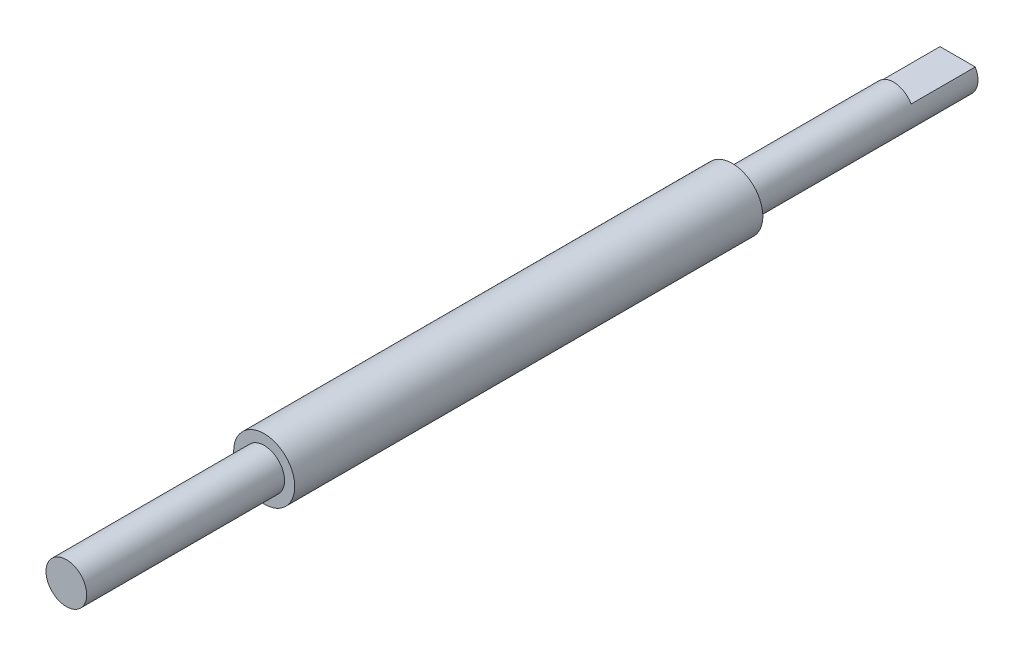
ISO-10303-21;
HEADER;
FILE_DESCRIPTION(('STEP AP214'),'2;1');
FILE_NAME('part.step','',(''),(''),'','','');
FILE_SCHEMA(('AUTOMOTIVE_DESIGN { 1 0 10303 214 1 1 1 1 }'));
ENDSEC;
DATA;
#1=APPLICATION_CONTEXT('core data for automotive mechanical design processes');
#2=APPLICATION_PROTOCOL_DEFINITION('international standard','automotive_design',2000,#1);
#3=PRODUCT_CONTEXT('',#1,'mechanical');
#4=PRODUCT('Part','Part','',(#3));
#5=PRODUCT_RELATED_PRODUCT_CATEGORY('part','',(#4));
#6=PRODUCT_DEFINITION_FORMATION('','',#4);
#7=PRODUCT_DEFINITION_CONTEXT('part definition',#1,'design');
#8=PRODUCT_DEFINITION('design','',#6,#7);
#9=PRODUCT_DEFINITION_SHAPE('','',#8);
#10=(LENGTH_UNIT() NAMED_UNIT(*) SI_UNIT(.MILLI.,.METRE.));
#11=(NAMED_UNIT(*) PLANE_ANGLE_UNIT() SI_UNIT($,.RADIAN.));
#12=(NAMED_UNIT(*) SI_UNIT($,.STERADIAN.) SOLID_ANGLE_UNIT());
#13=UNCERTAINTY_MEASURE_WITH_UNIT(LENGTH_MEASURE(1.E-05),#10,'distance_accuracy_value','');
#14=(GEOMETRIC_REPRESENTATION_CONTEXT(3) GLOBAL_UNCERTAINTY_ASSIGNED_CONTEXT((#13)) GLOBAL_UNIT_ASSIGNED_CONTEXT((#10,
#11,#12)) REPRESENTATION_CONTEXT('',''));
#15=CARTESIAN_POINT('',(0.,0.,0.));
#16=DIRECTION('',(0.,0.,1.));
#17=DIRECTION('',(1.,0.,0.));
#18=AXIS2_PLACEMENT_3D('',#15,#16,#17);
#19=CARTESIAN_POINT('',(0.,0.,0.));
#20=DIRECTION('',(0.,0.,1.));
#21=DIRECTION('',(1.,0.,0.));
#22=AXIS2_PLACEMENT_3D('',#19,#20,#21);
#23=PLANE('',#22);
#24=DIRECTION('',(1.,0.,0.));
#25=VECTOR('',#24,1.);
#26=CARTESIAN_POINT('',(-5.49926131403118,3.175,0.));
#27=LINE('',#26,#25);
#28=CARTESIAN_POINT('',(-5.49926131403118,3.175,0.));
#29=VERTEX_POINT('',#28);
#30=CARTESIAN_POINT('',(5.49926131403118,3.175,0.));
#31=VERTEX_POINT('',#30);
#32=EDGE_CURVE('E67',#29,#31,#27,.T.);
#33=ORIENTED_EDGE('',*,*,#32,.T.);
#34=CARTESIAN_POINT('',(0.,0.,0.));
#35=DIRECTION('',(0.,0.,1.));
#36=DIRECTION('',(1.,0.,0.));
#37=AXIS2_PLACEMENT_3D('',#34,#35,#36);
#38=CIRCLE('',#37,6.35);
#39=EDGE_CURVE('E79',#29,#31,#38,.T.);
#40=ORIENTED_EDGE('',*,*,#39,.F.);
#41=EDGE_LOOP('',(#33,#40));
#42=FACE_BOUND('',#41,.T.);
#43=ADVANCED_FACE('F41',(#42),#23,.F.);
#44=CARTESIAN_POINT('',(0.,0.,278.));
#45=DIRECTION('',(0.,0.,-1.));
#46=DIRECTION('',(-1.,0.,0.));
#47=AXIS2_PLACEMENT_3D('',#44,#45,#46);
#48=CYLINDRICAL_SURFACE('',#47,6.35);
#49=CARTESIAN_POINT('',(0.,0.,70.2975));
#50=DIRECTION('',(0.,0.,-1.));
#51=DIRECTION('',(-1.,0.,0.));
#52=AXIS2_PLACEMENT_3D('',#49,#50,#51);
#53=CIRCLE('',#52,6.35);
#54=CARTESIAN_POINT('',(-6.35,0.,70.2975));
#55=VERTEX_POINT('',#54);
#56=EDGE_CURVE('E84',#55,#55,#53,.T.);
#57=ORIENTED_EDGE('',*,*,#56,.T.);
#58=EDGE_LOOP('',(#57));
#59=FACE_BOUND('',#58,.T.);
#60=DIRECTION('',(0.,0.,-1.));
#61=VECTOR('',#60,1.);
#62=CARTESIAN_POINT('',(5.49926131403118,3.175,20.));
#63=LINE('',#62,#61);
#64=CARTESIAN_POINT('',(5.49926131403118,3.175,20.));
#65=VERTEX_POINT('',#64);
#66=EDGE_CURVE('E70',#65,#31,#63,.T.);
#67=ORIENTED_EDGE('',*,*,#66,.F.);
#68=CARTESIAN_POINT('',(0.,0.,20.));
#69=DIRECTION('',(0.,0.,1.));
#70=DIRECTION('',(1.,0.,0.));
#71=AXIS2_PLACEMENT_3D('',#68,#69,#70);
#72=CIRCLE('',#71,6.35);
#73=CARTESIAN_POINT('',(-5.49926131403118,3.175,20.));
#74=VERTEX_POINT('',#73);
#75=EDGE_CURVE('E75',#65,#74,#72,.T.);
#76=ORIENTED_EDGE('',*,*,#75,.T.);
#77=DIRECTION('',(0.,0.,-1.));
#78=VECTOR('',#77,1.);
#79=CARTESIAN_POINT('',(-5.49926131403118,3.175,20.));
#80=LINE('',#79,#78);
#81=EDGE_CURVE('E57',#74,#29,#80,.T.);
#82=ORIENTED_EDGE('',*,*,#81,.T.);
#83=ORIENTED_EDGE('',*,*,#39,.T.);
#84=EDGE_LOOP('',(#67,#76,#82,#83));
#85=FACE_BOUND('',#84,.T.);
#86=ADVANCED_FACE('F43',(#59,#85),#48,.T.);
#87=CARTESIAN_POINT('',(0.,0.,278.));
#88=DIRECTION('',(0.,0.,1.));
#89=DIRECTION('',(1.,0.,0.));
#90=AXIS2_PLACEMENT_3D('',#87,#88,#89);
#91=CIRCLE('',#90,6.35);
#92=CARTESIAN_POINT('',(6.35,0.,278.));
#93=VERTEX_POINT('',#92);
#94=EDGE_CURVE('E50',#93,#93,#91,.T.);
#95=ORIENTED_EDGE('',*,*,#94,.F.);
#96=EDGE_LOOP('',(#95));
#97=FACE_BOUND('',#96,.T.);
#98=CARTESIAN_POINT('',(0.,0.,216.2975));
#99=DIRECTION('',(0.,0.,-1.));
#100=DIRECTION('',(-1.,0.,0.));
#101=AXIS2_PLACEMENT_3D('',#98,#99,#100);
#102=CIRCLE('',#101,6.35);
#103=CARTESIAN_POINT('',(-6.35,0.,216.2975));
#104=VERTEX_POINT('',#103);
#105=EDGE_CURVE('E11',#104,#104,#102,.T.);
#106=ORIENTED_EDGE('',*,*,#105,.F.);
#107=EDGE_LOOP('',(#106));
#108=FACE_BOUND('',#107,.T.);
#109=ADVANCED_FACE('F136',(#97,#108),#48,.T.);
#110=CARTESIAN_POINT('',(0.,0.,278.));
#111=DIRECTION('',(0.,0.,1.));
#112=DIRECTION('',(1.,0.,0.));
#113=AXIS2_PLACEMENT_3D('',#110,#111,#112);
#114=PLANE('',#113);
#115=ORIENTED_EDGE('',*,*,#94,.T.);
#116=EDGE_LOOP('',(#115));
#117=FACE_BOUND('',#116,.T.);
#118=ADVANCED_FACE('F129',(#117),#114,.T.);
#119=CARTESIAN_POINT('',(0.,0.,216.2975));
#120=DIRECTION('',(0.,0.,-1.));
#121=DIRECTION('',(-1.,0.,0.));
#122=AXIS2_PLACEMENT_3D('',#119,#120,#121);
#123=CYLINDRICAL_SURFACE('',#122,9.525);
#124=CARTESIAN_POINT('',(0.,0.,216.2975));
#125=DIRECTION('',(0.,0.,-1.));
#126=DIRECTION('',(-1.,0.,0.));
#127=AXIS2_PLACEMENT_3D('',#124,#125,#126);
#128=CIRCLE('',#127,9.525);
#129=CARTESIAN_POINT('',(-9.525,0.,216.2975));
#130=VERTEX_POINT('',#129);
#131=EDGE_CURVE('E92',#130,#130,#128,.T.);
#132=ORIENTED_EDGE('',*,*,#131,.T.);
#133=EDGE_LOOP('',(#132));
#134=FACE_BOUND('',#133,.T.);
#135=CARTESIAN_POINT('',(0.,0.,70.2975));
#136=DIRECTION('',(0.,0.,-1.));
#137=DIRECTION('',(-1.,0.,0.));
#138=AXIS2_PLACEMENT_3D('',#135,#136,#137);
#139=CIRCLE('',#138,9.525);
#140=CARTESIAN_POINT('',(-9.525,0.,70.2975));
#141=VERTEX_POINT('',#140);
#142=EDGE_CURVE('E81',#141,#141,#139,.T.);
#143=ORIENTED_EDGE('',*,*,#142,.F.);
#144=EDGE_LOOP('',(#143));
#145=FACE_BOUND('',#144,.T.);
#146=ADVANCED_FACE('F115',(#134,#145),#123,.T.);
#147=CARTESIAN_POINT('',(0.,0.,216.2975));
#148=DIRECTION('',(0.,0.,-1.));
#149=DIRECTION('',(-1.,0.,0.));
#150=AXIS2_PLACEMENT_3D('',#147,#148,#149);
#151=PLANE('',#150);
#152=ORIENTED_EDGE('',*,*,#105,.T.);
#153=EDGE_LOOP('',(#152));
#154=FACE_BOUND('',#153,.T.);
#155=ORIENTED_EDGE('',*,*,#131,.F.);
#156=EDGE_LOOP('',(#155));
#157=FACE_BOUND('',#156,.T.);
#158=ADVANCED_FACE('F118',(#154,#157),#151,.F.);
#159=CARTESIAN_POINT('',(0.,0.,70.2975));
#160=DIRECTION('',(0.,0.,-1.));
#161=DIRECTION('',(-1.,0.,0.));
#162=AXIS2_PLACEMENT_3D('',#159,#160,#161);
#163=PLANE('',#162);
#164=ORIENTED_EDGE('',*,*,#56,.F.);
#165=EDGE_LOOP('',(#164));
#166=FACE_BOUND('',#165,.T.);
#167=ORIENTED_EDGE('',*,*,#142,.T.);
#168=EDGE_LOOP('',(#167));
#169=FACE_BOUND('',#168,.T.);
#170=ADVANCED_FACE('F120',(#166,#169),#163,.T.);
#171=CARTESIAN_POINT('',(-5.49926131403118,3.175,20.));
#172=DIRECTION('',(0.,1.,0.));
#173=DIRECTION('',(0.,0.,1.));
#174=AXIS2_PLACEMENT_3D('',#171,#172,#173);
#175=PLANE('',#174);
#176=ORIENTED_EDGE('',*,*,#32,.F.);
#177=ORIENTED_EDGE('',*,*,#81,.F.);
#178=DIRECTION('',(1.,0.,0.));
#179=VECTOR('',#178,1.);
#180=CARTESIAN_POINT('',(-5.49926131403118,3.175,20.));
#181=LINE('',#180,#179);
#182=EDGE_CURVE('E62',#74,#65,#181,.T.);
#183=ORIENTED_EDGE('',*,*,#182,.T.);
#184=ORIENTED_EDGE('',*,*,#66,.T.);
#185=EDGE_LOOP('',(#176,#177,#183,#184));
#186=FACE_BOUND('',#185,.T.);
#187=ADVANCED_FACE('F68',(#186),#175,.T.);
#188=CARTESIAN_POINT('',(0.,0.,20.));
#189=DIRECTION('',(0.,0.,1.));
#190=DIRECTION('',(1.,0.,0.));
#191=AXIS2_PLACEMENT_3D('',#188,#189,#190);
#192=PLANE('',#191);
#193=ORIENTED_EDGE('',*,*,#75,.F.);
#194=ORIENTED_EDGE('',*,*,#182,.F.);
#195=EDGE_LOOP('',(#193,#194));
#196=FACE_BOUND('',#195,.T.);
#197=ADVANCED_FACE('F184',(#196),#192,.F.);
#198=CLOSED_SHELL('',(#43,#86,#109,#118,#146,#158,#170,#187,#197));
#199=MANIFOLD_SOLID_BREP('B2',#198);
#200=ADVANCED_BREP_SHAPE_REPRESENTATION('',(#18,#199),#14);
#201=SHAPE_DEFINITION_REPRESENTATION(#9,#200);
ENDSEC;
END-ISO-10303-21;
